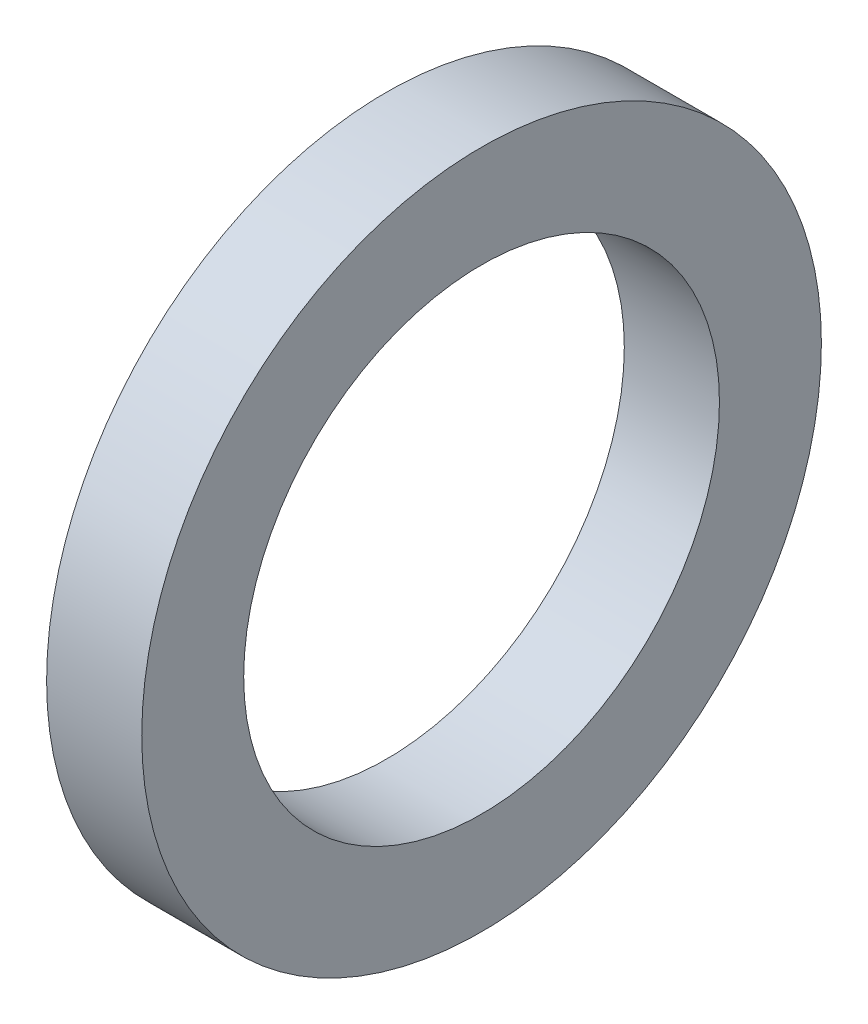
ISO-10303-21;
HEADER;
FILE_DESCRIPTION(('STEP AP214'),'2;1');
FILE_NAME('part.step','',(''),(''),'','','');
FILE_SCHEMA(('AUTOMOTIVE_DESIGN { 1 0 10303 214 1 1 1 1 }'));
ENDSEC;
DATA;
#1=APPLICATION_CONTEXT('core data for automotive mechanical design processes');
#2=APPLICATION_PROTOCOL_DEFINITION('international standard','automotive_design',2000,#1);
#3=PRODUCT_CONTEXT('',#1,'mechanical');
#4=PRODUCT('Part','Part','',(#3));
#5=PRODUCT_RELATED_PRODUCT_CATEGORY('part','',(#4));
#6=PRODUCT_DEFINITION_FORMATION('','',#4);
#7=PRODUCT_DEFINITION_CONTEXT('part definition',#1,'design');
#8=PRODUCT_DEFINITION('design','',#6,#7);
#9=PRODUCT_DEFINITION_SHAPE('','',#8);
#10=(LENGTH_UNIT() NAMED_UNIT(*) SI_UNIT(.MILLI.,.METRE.));
#11=(NAMED_UNIT(*) PLANE_ANGLE_UNIT() SI_UNIT($,.RADIAN.));
#12=(NAMED_UNIT(*) SI_UNIT($,.STERADIAN.) SOLID_ANGLE_UNIT());
#13=UNCERTAINTY_MEASURE_WITH_UNIT(LENGTH_MEASURE(1.E-05),#10,'distance_accuracy_value','');
#14=(GEOMETRIC_REPRESENTATION_CONTEXT(3) GLOBAL_UNCERTAINTY_ASSIGNED_CONTEXT((#13)) GLOBAL_UNIT_ASSIGNED_CONTEXT((#10,
#11,#12)) REPRESENTATION_CONTEXT('',''));
#15=CARTESIAN_POINT('',(0.,0.,0.));
#16=DIRECTION('',(0.,0.,1.));
#17=DIRECTION('',(1.,0.,0.));
#18=AXIS2_PLACEMENT_3D('',#15,#16,#17);
#19=CARTESIAN_POINT('',(7.,0.,0.));
#20=DIRECTION('',(1.,0.,0.));
#21=DIRECTION('',(0.,0.,-1.));
#22=AXIS2_PLACEMENT_3D('',#19,#20,#21);
#23=PLANE('',#22);
#24=CARTESIAN_POINT('',(7.,0.,0.));
#25=DIRECTION('',(1.,0.,0.));
#26=DIRECTION('',(0.,0.,-1.));
#27=AXIS2_PLACEMENT_3D('',#24,#25,#26);
#28=CIRCLE('',#27,25.);
#29=CARTESIAN_POINT('',(7.,0.,-25.));
#30=VERTEX_POINT('',#29);
#31=EDGE_CURVE('E10',#30,#30,#28,.T.);
#32=ORIENTED_EDGE('',*,*,#31,.T.);
#33=EDGE_LOOP('',(#32));
#34=FACE_BOUND('',#33,.T.);
#35=CARTESIAN_POINT('',(7.,0.,0.));
#36=DIRECTION('',(1.,0.,0.));
#37=DIRECTION('',(0.,0.,-1.));
#38=AXIS2_PLACEMENT_3D('',#35,#36,#37);
#39=CIRCLE('',#38,17.5);
#40=CARTESIAN_POINT('',(7.,0.,-17.5));
#41=VERTEX_POINT('',#40);
#42=EDGE_CURVE('E50',#41,#41,#39,.T.);
#43=ORIENTED_EDGE('',*,*,#42,.F.);
#44=EDGE_LOOP('',(#43));
#45=FACE_BOUND('',#44,.T.);
#46=ADVANCED_FACE('F37',(#34,#45),#23,.T.);
#47=CARTESIAN_POINT('',(0.,0.,0.));
#48=DIRECTION('',(1.,0.,0.));
#49=DIRECTION('',(0.,0.,-1.));
#50=AXIS2_PLACEMENT_3D('',#47,#48,#49);
#51=PLANE('',#50);
#52=CARTESIAN_POINT('',(0.,0.,0.));
#53=DIRECTION('',(1.,0.,0.));
#54=DIRECTION('',(0.,0.,-1.));
#55=AXIS2_PLACEMENT_3D('',#52,#53,#54);
#56=CIRCLE('',#55,25.);
#57=CARTESIAN_POINT('',(0.,0.,-25.));
#58=VERTEX_POINT('',#57);
#59=EDGE_CURVE('E41',#58,#58,#56,.T.);
#60=ORIENTED_EDGE('',*,*,#59,.F.);
#61=EDGE_LOOP('',(#60));
#62=FACE_BOUND('',#61,.T.);
#63=CARTESIAN_POINT('',(0.,0.,0.));
#64=DIRECTION('',(1.,0.,0.));
#65=DIRECTION('',(0.,0.,-1.));
#66=AXIS2_PLACEMENT_3D('',#63,#64,#65);
#67=CIRCLE('',#66,17.5);
#68=CARTESIAN_POINT('',(0.,0.,-17.5));
#69=VERTEX_POINT('',#68);
#70=EDGE_CURVE('E52',#69,#69,#67,.T.);
#71=ORIENTED_EDGE('',*,*,#70,.T.);
#72=EDGE_LOOP('',(#71));
#73=FACE_BOUND('',#72,.T.);
#74=ADVANCED_FACE('F64',(#62,#73),#51,.F.);
#75=CARTESIAN_POINT('',(7.,0.,0.));
#76=DIRECTION('',(-1.,0.,0.));
#77=DIRECTION('',(0.,0.,1.));
#78=AXIS2_PLACEMENT_3D('',#75,#76,#77);
#79=CYLINDRICAL_SURFACE('',#78,25.);
#80=ORIENTED_EDGE('',*,*,#31,.F.);
#81=EDGE_LOOP('',(#80));
#82=FACE_BOUND('',#81,.T.);
#83=ORIENTED_EDGE('',*,*,#59,.T.);
#84=EDGE_LOOP('',(#83));
#85=FACE_BOUND('',#84,.T.);
#86=ADVANCED_FACE('F39',(#82,#85),#79,.T.);
#87=CARTESIAN_POINT('',(7.,0.,0.));
#88=DIRECTION('',(-1.,0.,0.));
#89=DIRECTION('',(0.,0.,1.));
#90=AXIS2_PLACEMENT_3D('',#87,#88,#89);
#91=CYLINDRICAL_SURFACE('',#90,17.5);
#92=ORIENTED_EDGE('',*,*,#42,.T.);
#93=EDGE_LOOP('',(#92));
#94=FACE_BOUND('',#93,.T.);
#95=ORIENTED_EDGE('',*,*,#70,.F.);
#96=EDGE_LOOP('',(#95));
#97=FACE_BOUND('',#96,.T.);
#98=ADVANCED_FACE('F60',(#94,#97),#91,.F.);
#99=CLOSED_SHELL('',(#46,#74,#86,#98));
#100=MANIFOLD_SOLID_BREP('B2',#99);
#101=ADVANCED_BREP_SHAPE_REPRESENTATION('',(#18,#100),#14);
#102=SHAPE_DEFINITION_REPRESENTATION(#9,#101);
ENDSEC;
END-ISO-10303-21;
